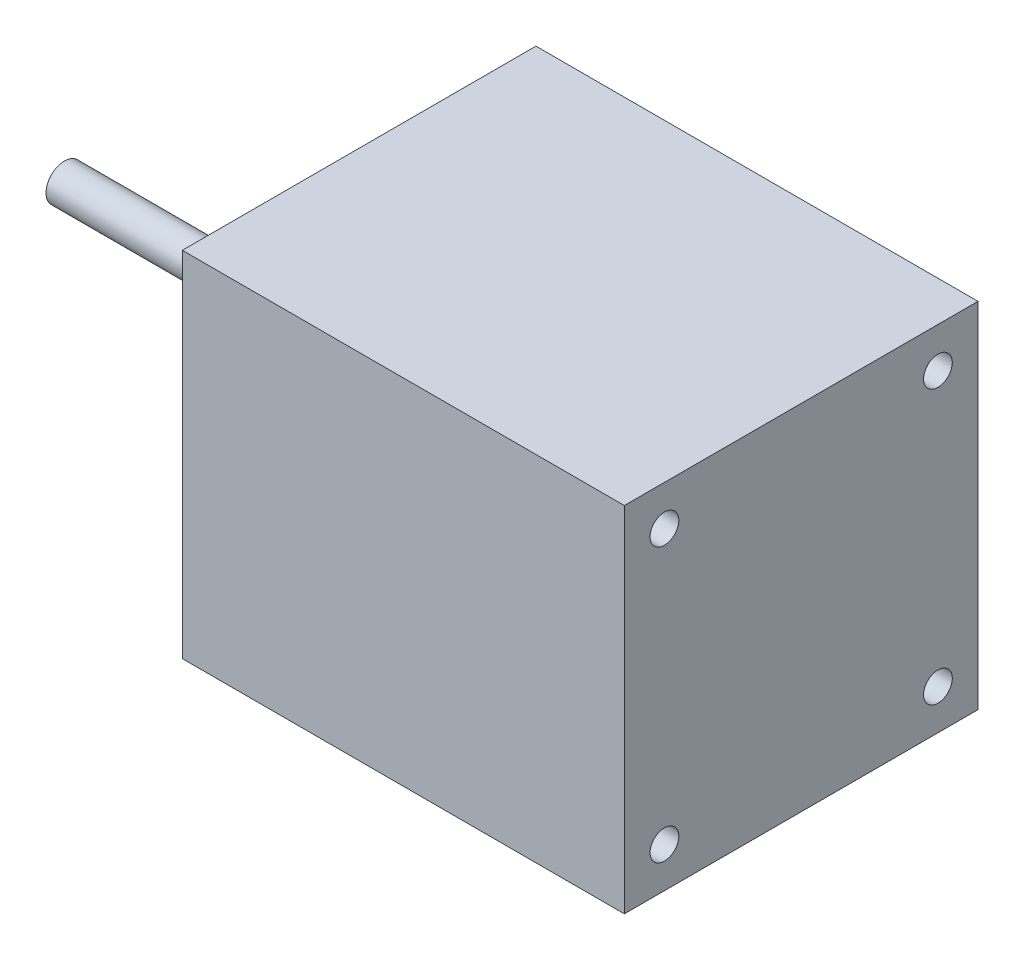
ISO-10303-21;
HEADER;
FILE_DESCRIPTION(('STEP AP214'),'2;1');
FILE_NAME('part.step','',(''),(''),'','','');
FILE_SCHEMA(('AUTOMOTIVE_DESIGN { 1 0 10303 214 1 1 1 1 }'));
ENDSEC;
DATA;
#1=APPLICATION_CONTEXT('core data for automotive mechanical design processes');
#2=APPLICATION_PROTOCOL_DEFINITION('international standard','automotive_design',2000,#1);
#3=PRODUCT_CONTEXT('',#1,'mechanical');
#4=PRODUCT('Part','Part','',(#3));
#5=PRODUCT_RELATED_PRODUCT_CATEGORY('part','',(#4));
#6=PRODUCT_DEFINITION_FORMATION('','',#4);
#7=PRODUCT_DEFINITION_CONTEXT('part definition',#1,'design');
#8=PRODUCT_DEFINITION('design','',#6,#7);
#9=PRODUCT_DEFINITION_SHAPE('','',#8);
#10=(LENGTH_UNIT() NAMED_UNIT(*) SI_UNIT(.MILLI.,.METRE.));
#11=(NAMED_UNIT(*) PLANE_ANGLE_UNIT() SI_UNIT($,.RADIAN.));
#12=(NAMED_UNIT(*) SI_UNIT($,.STERADIAN.) SOLID_ANGLE_UNIT());
#13=UNCERTAINTY_MEASURE_WITH_UNIT(LENGTH_MEASURE(1.E-05),#10,'distance_accuracy_value','');
#14=(GEOMETRIC_REPRESENTATION_CONTEXT(3) GLOBAL_UNCERTAINTY_ASSIGNED_CONTEXT((#13)) GLOBAL_UNIT_ASSIGNED_CONTEXT((#10,
#11,#12)) REPRESENTATION_CONTEXT('',''));
#15=CARTESIAN_POINT('',(0.,0.,0.));
#16=DIRECTION('',(0.,0.,1.));
#17=DIRECTION('',(1.,0.,0.));
#18=AXIS2_PLACEMENT_3D('',#15,#16,#17);
#19=CARTESIAN_POINT('',(76.2,0.,0.));
#20=DIRECTION('',(1.,0.,0.));
#21=DIRECTION('',(0.,0.,-1.));
#22=AXIS2_PLACEMENT_3D('',#19,#20,#21);
#23=PLANE('',#22);
#24=CARTESIAN_POINT('',(76.2,-23.5731723178065,23.5731723178065));
#25=DIRECTION('',(1.,0.,0.));
#26=DIRECTION('',(0.,0.,-1.));
#27=AXIS2_PLACEMENT_3D('',#24,#25,#26);
#28=CIRCLE('',#27,2.4765);
#29=CARTESIAN_POINT('',(76.2,-23.5731723178065,26.0496723178065));
#30=VERTEX_POINT('',#29);
#31=EDGE_CURVE('E249',#30,#30,#28,.T.);
#32=ORIENTED_EDGE('',*,*,#31,.F.);
#33=EDGE_LOOP('',(#32));
#34=FACE_BOUND('',#33,.T.);
#35=CARTESIAN_POINT('',(76.2,23.5731723178065,-23.5731723178065));
#36=DIRECTION('',(1.,0.,0.));
#37=DIRECTION('',(0.,0.,-1.));
#38=AXIS2_PLACEMENT_3D('',#35,#36,#37);
#39=CIRCLE('',#38,2.4765);
#40=CARTESIAN_POINT('',(76.2,23.5731723178065,-21.0966723178065));
#41=VERTEX_POINT('',#40);
#42=EDGE_CURVE('E174',#41,#41,#39,.T.);
#43=ORIENTED_EDGE('',*,*,#42,.F.);
#44=EDGE_LOOP('',(#43));
#45=FACE_BOUND('',#44,.T.);
#46=DIRECTION('',(0.,0.,-1.));
#47=VECTOR('',#46,1.);
#48=CARTESIAN_POINT('',(76.2,-30.48,30.48));
#49=LINE('',#48,#47);
#50=CARTESIAN_POINT('',(76.2,-30.48,30.48));
#51=VERTEX_POINT('',#50);
#52=CARTESIAN_POINT('',(76.2,-30.48,-30.48));
#53=VERTEX_POINT('',#52);
#54=EDGE_CURVE('E151',#51,#53,#49,.T.);
#55=ORIENTED_EDGE('',*,*,#54,.T.);
#56=DIRECTION('',(0.,1.,0.));
#57=VECTOR('',#56,1.);
#58=CARTESIAN_POINT('',(76.2,-30.48,-30.48));
#59=LINE('',#58,#57);
#60=CARTESIAN_POINT('',(76.2,30.48,-30.48));
#61=VERTEX_POINT('',#60);
#62=EDGE_CURVE('E143',#53,#61,#59,.T.);
#63=ORIENTED_EDGE('',*,*,#62,.T.);
#64=DIRECTION('',(0.,0.,-1.));
#65=VECTOR('',#64,1.);
#66=CARTESIAN_POINT('',(76.2,30.48,30.48));
#67=LINE('',#66,#65);
#68=CARTESIAN_POINT('',(76.2,30.48,30.48));
#69=VERTEX_POINT('',#68);
#70=EDGE_CURVE('E150',#69,#61,#67,.T.);
#71=ORIENTED_EDGE('',*,*,#70,.F.);
#72=DIRECTION('',(0.,1.,0.));
#73=VECTOR('',#72,1.);
#74=CARTESIAN_POINT('',(76.2,-30.48,30.48));
#75=LINE('',#74,#73);
#76=EDGE_CURVE('E165',#51,#69,#75,.T.);
#77=ORIENTED_EDGE('',*,*,#76,.F.);
#78=EDGE_LOOP('',(#55,#63,#71,#77));
#79=FACE_BOUND('',#78,.T.);
#80=CARTESIAN_POINT('',(76.2,23.5731723178065,23.5731723178065));
#81=DIRECTION('',(1.,0.,0.));
#82=DIRECTION('',(0.,0.,-1.));
#83=AXIS2_PLACEMENT_3D('',#80,#81,#82);
#84=CIRCLE('',#83,2.4765);
#85=CARTESIAN_POINT('',(76.2,23.5731723178065,26.0496723178065));
#86=VERTEX_POINT('',#85);
#87=EDGE_CURVE('E257',#86,#86,#84,.T.);
#88=ORIENTED_EDGE('',*,*,#87,.F.);
#89=EDGE_LOOP('',(#88));
#90=FACE_BOUND('',#89,.T.);
#91=CARTESIAN_POINT('',(76.2,-23.5731723178065,-23.5731723178065));
#92=DIRECTION('',(1.,0.,0.));
#93=DIRECTION('',(0.,0.,-1.));
#94=AXIS2_PLACEMENT_3D('',#91,#92,#93);
#95=CIRCLE('',#94,2.4765);
#96=CARTESIAN_POINT('',(76.2,-23.5731723178065,-21.0966723178065));
#97=VERTEX_POINT('',#96);
#98=EDGE_CURVE('E242',#97,#97,#95,.T.);
#99=ORIENTED_EDGE('',*,*,#98,.F.);
#100=EDGE_LOOP('',(#99));
#101=FACE_BOUND('',#100,.T.);
#102=ADVANCED_FACE('F99',(#34,#45,#79,#90,#101),#23,.T.);
#103=CARTESIAN_POINT('',(0.,0.,0.));
#104=DIRECTION('',(1.,0.,0.));
#105=DIRECTION('',(0.,0.,-1.));
#106=AXIS2_PLACEMENT_3D('',#103,#104,#105);
#107=PLANE('',#106);
#108=CARTESIAN_POINT('',(0.,0.,0.));
#109=DIRECTION('',(1.,0.,0.));
#110=DIRECTION('',(0.,0.,-1.));
#111=AXIS2_PLACEMENT_3D('',#108,#109,#110);
#112=CIRCLE('',#111,3.175);
#113=CARTESIAN_POINT('',(0.,0.,-3.175));
#114=VERTEX_POINT('',#113);
#115=EDGE_CURVE('E12',#114,#114,#112,.F.);
#116=ORIENTED_EDGE('',*,*,#115,.F.);
#117=EDGE_LOOP('',(#116));
#118=FACE_BOUND('',#117,.T.);
#119=DIRECTION('',(0.,0.,-1.));
#120=VECTOR('',#119,1.);
#121=CARTESIAN_POINT('',(0.,-30.48,30.48));
#122=LINE('',#121,#120);
#123=CARTESIAN_POINT('',(0.,-30.48,30.48));
#124=VERTEX_POINT('',#123);
#125=CARTESIAN_POINT('',(0.,-30.48,-30.48));
#126=VERTEX_POINT('',#125);
#127=EDGE_CURVE('E171',#124,#126,#122,.T.);
#128=ORIENTED_EDGE('',*,*,#127,.F.);
#129=DIRECTION('',(0.,1.,0.));
#130=VECTOR('',#129,1.);
#131=CARTESIAN_POINT('',(0.,-30.48,30.48));
#132=LINE('',#131,#130);
#133=CARTESIAN_POINT('',(0.,30.48,30.48));
#134=VERTEX_POINT('',#133);
#135=EDGE_CURVE('E180',#124,#134,#132,.T.);
#136=ORIENTED_EDGE('',*,*,#135,.T.);
#137=DIRECTION('',(0.,0.,-1.));
#138=VECTOR('',#137,1.);
#139=CARTESIAN_POINT('',(0.,30.48,30.48));
#140=LINE('',#139,#138);
#141=CARTESIAN_POINT('',(0.,30.48,-30.48));
#142=VERTEX_POINT('',#141);
#143=EDGE_CURVE('E177',#134,#142,#140,.T.);
#144=ORIENTED_EDGE('',*,*,#143,.T.);
#145=DIRECTION('',(0.,1.,0.));
#146=VECTOR('',#145,1.);
#147=CARTESIAN_POINT('',(0.,-30.48,-30.48));
#148=LINE('',#147,#146);
#149=EDGE_CURVE('E158',#126,#142,#148,.T.);
#150=ORIENTED_EDGE('',*,*,#149,.F.);
#151=EDGE_LOOP('',(#128,#136,#144,#150));
#152=FACE_BOUND('',#151,.T.);
#153=CARTESIAN_POINT('',(0.,23.5731723178065,-23.5731723178065));
#154=DIRECTION('',(1.,0.,0.));
#155=DIRECTION('',(0.,0.,-1.));
#156=AXIS2_PLACEMENT_3D('',#153,#154,#155);
#157=CIRCLE('',#156,2.4765);
#158=CARTESIAN_POINT('',(0.,23.5731723178065,-21.0966723178065));
#159=VERTEX_POINT('',#158);
#160=EDGE_CURVE('E261',#159,#159,#157,.T.);
#161=ORIENTED_EDGE('',*,*,#160,.T.);
#162=EDGE_LOOP('',(#161));
#163=FACE_BOUND('',#162,.T.);
#164=CARTESIAN_POINT('',(0.,23.5731723178065,23.5731723178065));
#165=DIRECTION('',(1.,0.,0.));
#166=DIRECTION('',(0.,0.,-1.));
#167=AXIS2_PLACEMENT_3D('',#164,#165,#166);
#168=CIRCLE('',#167,2.4765);
#169=CARTESIAN_POINT('',(0.,23.5731723178065,26.0496723178065));
#170=VERTEX_POINT('',#169);
#171=EDGE_CURVE('E253',#170,#170,#168,.T.);
#172=ORIENTED_EDGE('',*,*,#171,.T.);
#173=EDGE_LOOP('',(#172));
#174=FACE_BOUND('',#173,.T.);
#175=CARTESIAN_POINT('',(0.,-23.5731723178065,23.5731723178065));
#176=DIRECTION('',(1.,0.,0.));
#177=DIRECTION('',(0.,0.,-1.));
#178=AXIS2_PLACEMENT_3D('',#175,#176,#177);
#179=CIRCLE('',#178,2.4765);
#180=CARTESIAN_POINT('',(0.,-23.5731723178065,26.0496723178065));
#181=VERTEX_POINT('',#180);
#182=EDGE_CURVE('E247',#181,#181,#179,.T.);
#183=ORIENTED_EDGE('',*,*,#182,.T.);
#184=EDGE_LOOP('',(#183));
#185=FACE_BOUND('',#184,.T.);
#186=CARTESIAN_POINT('',(0.,-23.5731723178065,-23.5731723178065));
#187=DIRECTION('',(1.,0.,0.));
#188=DIRECTION('',(0.,0.,-1.));
#189=AXIS2_PLACEMENT_3D('',#186,#187,#188);
#190=CIRCLE('',#189,2.4765);
#191=CARTESIAN_POINT('',(0.,-23.5731723178065,-21.0966723178065));
#192=VERTEX_POINT('',#191);
#193=EDGE_CURVE('E238',#192,#192,#190,.T.);
#194=ORIENTED_EDGE('',*,*,#193,.T.);
#195=EDGE_LOOP('',(#194));
#196=FACE_BOUND('',#195,.T.);
#197=ADVANCED_FACE('F189',(#118,#152,#163,#174,#185,#196),#107,.F.);
#198=CARTESIAN_POINT('',(76.2,-30.48,30.48));
#199=DIRECTION('',(0.,1.,0.));
#200=DIRECTION('',(0.,0.,1.));
#201=AXIS2_PLACEMENT_3D('',#198,#199,#200);
#202=PLANE('',#201);
#203=ORIENTED_EDGE('',*,*,#127,.T.);
#204=DIRECTION('',(-1.,0.,0.));
#205=VECTOR('',#204,1.);
#206=CARTESIAN_POINT('',(76.2,-30.48,-30.48));
#207=LINE('',#206,#205);
#208=EDGE_CURVE('E109',#53,#126,#207,.T.);
#209=ORIENTED_EDGE('',*,*,#208,.F.);
#210=ORIENTED_EDGE('',*,*,#54,.F.);
#211=DIRECTION('',(-1.,0.,0.));
#212=VECTOR('',#211,1.);
#213=CARTESIAN_POINT('',(76.2,-30.48,30.48));
#214=LINE('',#213,#212);
#215=EDGE_CURVE('E117',#51,#124,#214,.T.);
#216=ORIENTED_EDGE('',*,*,#215,.T.);
#217=EDGE_LOOP('',(#203,#209,#210,#216));
#218=FACE_BOUND('',#217,.T.);
#219=ADVANCED_FACE('F101',(#218),#202,.F.);
#220=CARTESIAN_POINT('',(76.2,-30.48,-30.48));
#221=DIRECTION('',(0.,0.,1.));
#222=DIRECTION('',(1.,0.,0.));
#223=AXIS2_PLACEMENT_3D('',#220,#221,#222);
#224=PLANE('',#223);
#225=ORIENTED_EDGE('',*,*,#149,.T.);
#226=DIRECTION('',(-1.,0.,0.));
#227=VECTOR('',#226,1.);
#228=CARTESIAN_POINT('',(76.2,30.48,-30.48));
#229=LINE('',#228,#227);
#230=EDGE_CURVE('E156',#61,#142,#229,.T.);
#231=ORIENTED_EDGE('',*,*,#230,.F.);
#232=ORIENTED_EDGE('',*,*,#62,.F.);
#233=ORIENTED_EDGE('',*,*,#208,.T.);
#234=EDGE_LOOP('',(#225,#231,#232,#233));
#235=FACE_BOUND('',#234,.T.);
#236=ADVANCED_FACE('F157',(#235),#224,.F.);
#237=CARTESIAN_POINT('',(76.2,30.48,30.48));
#238=DIRECTION('',(0.,1.,0.));
#239=DIRECTION('',(0.,0.,1.));
#240=AXIS2_PLACEMENT_3D('',#237,#238,#239);
#241=PLANE('',#240);
#242=ORIENTED_EDGE('',*,*,#143,.F.);
#243=DIRECTION('',(-1.,0.,0.));
#244=VECTOR('',#243,1.);
#245=CARTESIAN_POINT('',(76.2,30.48,30.48));
#246=LINE('',#245,#244);
#247=EDGE_CURVE('E131',#69,#134,#246,.T.);
#248=ORIENTED_EDGE('',*,*,#247,.F.);
#249=ORIENTED_EDGE('',*,*,#70,.T.);
#250=ORIENTED_EDGE('',*,*,#230,.T.);
#251=EDGE_LOOP('',(#242,#248,#249,#250));
#252=FACE_BOUND('',#251,.T.);
#253=ADVANCED_FACE('F163',(#252),#241,.T.);
#254=CARTESIAN_POINT('',(76.2,-30.48,30.48));
#255=DIRECTION('',(0.,0.,1.));
#256=DIRECTION('',(1.,0.,0.));
#257=AXIS2_PLACEMENT_3D('',#254,#255,#256);
#258=PLANE('',#257);
#259=ORIENTED_EDGE('',*,*,#135,.F.);
#260=ORIENTED_EDGE('',*,*,#215,.F.);
#261=ORIENTED_EDGE('',*,*,#76,.T.);
#262=ORIENTED_EDGE('',*,*,#247,.T.);
#263=EDGE_LOOP('',(#259,#260,#261,#262));
#264=FACE_BOUND('',#263,.T.);
#265=ADVANCED_FACE('F191',(#264),#258,.T.);
#266=CARTESIAN_POINT('',(76.2,23.5731723178065,-23.5731723178065));
#267=DIRECTION('',(-1.,0.,0.));
#268=DIRECTION('',(0.,0.,1.));
#269=AXIS2_PLACEMENT_3D('',#266,#267,#268);
#270=CYLINDRICAL_SURFACE('',#269,2.4765);
#271=CARTESIAN_POINT('',(76.2,23.5731723178065,-21.0966723178065));
#272=CARTESIAN_POINT('',(75.40625,23.5731723178065,-21.0966723178065));
#273=CARTESIAN_POINT('',(74.6125,23.5731723178065,-21.0966723178065));
#274=CARTESIAN_POINT('',(73.025,23.5731723178065,-21.0966723178065));
#275=CARTESIAN_POINT('',(72.23125,23.5731723178065,-21.0966723178065));
#276=CARTESIAN_POINT('',(70.64375,23.5731723178065,-21.0966723178065));
#277=CARTESIAN_POINT('',(69.85,23.5731723178065,-21.0966723178065));
#278=CARTESIAN_POINT('',(68.2625,23.5731723178065,-21.0966723178065));
#279=CARTESIAN_POINT('',(67.46875,23.5731723178065,-21.0966723178065));
#280=CARTESIAN_POINT('',(65.88125,23.5731723178065,-21.0966723178065));
#281=CARTESIAN_POINT('',(65.0875,23.5731723178065,-21.0966723178065));
#282=CARTESIAN_POINT('',(63.5,23.5731723178065,-21.0966723178065));
#283=CARTESIAN_POINT('',(62.70625,23.5731723178065,-21.0966723178065));
#284=CARTESIAN_POINT('',(61.11875,23.5731723178065,-21.0966723178065));
#285=CARTESIAN_POINT('',(60.325,23.5731723178065,-21.0966723178065));
#286=CARTESIAN_POINT('',(58.7375,23.5731723178065,-21.0966723178065));
#287=CARTESIAN_POINT('',(57.94375,23.5731723178065,-21.0966723178065));
#288=CARTESIAN_POINT('',(56.35625,23.5731723178065,-21.0966723178065));
#289=CARTESIAN_POINT('',(55.5625,23.5731723178065,-21.0966723178065));
#290=CARTESIAN_POINT('',(53.975,23.5731723178065,-21.0966723178065));
#291=CARTESIAN_POINT('',(53.18125,23.5731723178065,-21.0966723178065));
#292=CARTESIAN_POINT('',(51.59375,23.5731723178065,-21.0966723178065));
#293=CARTESIAN_POINT('',(50.8,23.5731723178065,-21.0966723178065));
#294=CARTESIAN_POINT('',(49.2125,23.5731723178065,-21.0966723178065));
#295=CARTESIAN_POINT('',(48.41875,23.5731723178065,-21.0966723178065));
#296=CARTESIAN_POINT('',(46.83125,23.5731723178065,-21.0966723178065));
#297=CARTESIAN_POINT('',(46.0375,23.5731723178065,-21.0966723178065));
#298=CARTESIAN_POINT('',(44.45,23.5731723178065,-21.0966723178065));
#299=CARTESIAN_POINT('',(43.65625,23.5731723178065,-21.0966723178065));
#300=CARTESIAN_POINT('',(42.06875,23.5731723178065,-21.0966723178065));
#301=CARTESIAN_POINT('',(41.275,23.5731723178065,-21.0966723178065));
#302=CARTESIAN_POINT('',(39.6875,23.5731723178065,-21.0966723178065));
#303=CARTESIAN_POINT('',(38.89375,23.5731723178065,-21.0966723178065));
#304=CARTESIAN_POINT('',(37.30625,23.5731723178065,-21.0966723178065));
#305=CARTESIAN_POINT('',(36.5125,23.5731723178065,-21.0966723178065));
#306=CARTESIAN_POINT('',(34.925,23.5731723178065,-21.0966723178065));
#307=CARTESIAN_POINT('',(34.13125,23.5731723178065,-21.0966723178065));
#308=CARTESIAN_POINT('',(32.54375,23.5731723178065,-21.0966723178065));
#309=CARTESIAN_POINT('',(31.75,23.5731723178065,-21.0966723178065));
#310=CARTESIAN_POINT('',(30.1625,23.5731723178065,-21.0966723178065));
#311=CARTESIAN_POINT('',(29.36875,23.5731723178065,-21.0966723178065));
#312=CARTESIAN_POINT('',(27.78125,23.5731723178065,-21.0966723178065));
#313=CARTESIAN_POINT('',(26.9875,23.5731723178065,-21.0966723178065));
#314=CARTESIAN_POINT('',(25.4,23.5731723178065,-21.0966723178065));
#315=CARTESIAN_POINT('',(24.60625,23.5731723178065,-21.0966723178065));
#316=CARTESIAN_POINT('',(23.01875,23.5731723178065,-21.0966723178065));
#317=CARTESIAN_POINT('',(22.225,23.5731723178065,-21.0966723178065));
#318=CARTESIAN_POINT('',(20.6375,23.5731723178065,-21.0966723178065));
#319=CARTESIAN_POINT('',(19.84375,23.5731723178065,-21.0966723178065));
#320=CARTESIAN_POINT('',(18.25625,23.5731723178065,-21.0966723178065));
#321=CARTESIAN_POINT('',(17.4625,23.5731723178065,-21.0966723178065));
#322=CARTESIAN_POINT('',(15.875,23.5731723178065,-21.0966723178065));
#323=CARTESIAN_POINT('',(15.08125,23.5731723178065,-21.0966723178065));
#324=CARTESIAN_POINT('',(13.49375,23.5731723178065,-21.0966723178065));
#325=CARTESIAN_POINT('',(12.7,23.5731723178065,-21.0966723178065));
#326=CARTESIAN_POINT('',(11.1125,23.5731723178065,-21.0966723178065));
#327=CARTESIAN_POINT('',(10.31875,23.5731723178065,-21.0966723178065));
#328=CARTESIAN_POINT('',(8.73125,23.5731723178065,-21.0966723178065));
#329=CARTESIAN_POINT('',(7.93750000000001,23.5731723178065,-21.0966723178065));
#330=CARTESIAN_POINT('',(6.35,23.5731723178065,-21.0966723178065));
#331=CARTESIAN_POINT('',(5.55625,23.5731723178065,-21.0966723178065));
#332=CARTESIAN_POINT('',(3.96875,23.5731723178065,-21.0966723178065));
#333=CARTESIAN_POINT('',(3.175,23.5731723178065,-21.0966723178065));
#334=CARTESIAN_POINT('',(1.5875,23.5731723178065,-21.0966723178065));
#335=CARTESIAN_POINT('',(0.793750000000001,23.5731723178065,-21.0966723178065));
#336=CARTESIAN_POINT('',(0.,23.5731723178065,-21.0966723178065));
#337=B_SPLINE_CURVE_WITH_KNOTS('',3,(#271,#272,#273,#274,#275,#276,#277,#278,#279,#280,#281,
#282,#283,#284,#285,#286,#287,#288,#289,#290,#291,#292,#293,#294,#295,#296,#297,#298,#299,#300,
#301,#302,#303,#304,#305,#306,#307,#308,#309,#310,#311,#312,#313,#314,#315,#316,#317,#318,#319,
#320,#321,#322,#323,#324,#325,#326,#327,#328,#329,#330,#331,#332,#333,#334,#335,#336),
.UNSPECIFIED.,.F.,.F.,(4,2,2,2,2,2,2,2,2,2,2,2,2,2,2,2,2,2,2,2,2,2,2,2,2,2,2,2,2,2,2,2,4),(0.,
2.38125,4.7625,7.14375,9.52500000000001,11.90625,14.2875,16.66875,19.05,21.43125,23.8125,
26.19375,28.575,30.95625,33.3375,35.71875,38.1,40.48125,42.8625,45.24375,47.625,50.00625,
52.3875,54.76875,57.15,59.53125,61.9125,64.29375,66.675,69.05625,71.4375,73.81875,76.2),.UNSPECIFIED.);
#338=EDGE_CURVE('BSEAM193',#41,#159,#337,.T.);
#339=ORIENTED_EDGE('',*,*,#42,.T.);
#340=ORIENTED_EDGE('',*,*,#160,.F.);
#341=ORIENTED_EDGE('',*,*,#338,.T.);
#342=ORIENTED_EDGE('',*,*,#338,.F.);
#343=EDGE_LOOP('',(#339,#341,#340,#342));
#344=FACE_BOUND('',#343,.T.);
#345=ADVANCED_FACE('F193',(#344),#270,.F.);
#346=CARTESIAN_POINT('',(76.2,23.5731723178065,23.5731723178065));
#347=DIRECTION('',(-1.,0.,0.));
#348=DIRECTION('',(0.,0.,1.));
#349=AXIS2_PLACEMENT_3D('',#346,#347,#348);
#350=CYLINDRICAL_SURFACE('',#349,2.4765);
#351=CARTESIAN_POINT('',(76.2,23.5731723178065,26.0496723178065));
#352=CARTESIAN_POINT('',(75.40625,23.5731723178065,26.0496723178065));
#353=CARTESIAN_POINT('',(74.6125,23.5731723178065,26.0496723178065));
#354=CARTESIAN_POINT('',(73.025,23.5731723178065,26.0496723178065));
#355=CARTESIAN_POINT('',(72.23125,23.5731723178065,26.0496723178065));
#356=CARTESIAN_POINT('',(70.64375,23.5731723178065,26.0496723178065));
#357=CARTESIAN_POINT('',(69.85,23.5731723178065,26.0496723178065));
#358=CARTESIAN_POINT('',(68.2625,23.5731723178065,26.0496723178065));
#359=CARTESIAN_POINT('',(67.46875,23.5731723178065,26.0496723178065));
#360=CARTESIAN_POINT('',(65.88125,23.5731723178065,26.0496723178065));
#361=CARTESIAN_POINT('',(65.0875,23.5731723178065,26.0496723178065));
#362=CARTESIAN_POINT('',(63.5,23.5731723178065,26.0496723178065));
#363=CARTESIAN_POINT('',(62.70625,23.5731723178065,26.0496723178065));
#364=CARTESIAN_POINT('',(61.11875,23.5731723178065,26.0496723178065));
#365=CARTESIAN_POINT('',(60.325,23.5731723178065,26.0496723178065));
#366=CARTESIAN_POINT('',(58.7375,23.5731723178065,26.0496723178065));
#367=CARTESIAN_POINT('',(57.94375,23.5731723178065,26.0496723178065));
#368=CARTESIAN_POINT('',(56.35625,23.5731723178065,26.0496723178065));
#369=CARTESIAN_POINT('',(55.5625,23.5731723178065,26.0496723178065));
#370=CARTESIAN_POINT('',(53.975,23.5731723178065,26.0496723178065));
#371=CARTESIAN_POINT('',(53.18125,23.5731723178065,26.0496723178065));
#372=CARTESIAN_POINT('',(51.59375,23.5731723178065,26.0496723178065));
#373=CARTESIAN_POINT('',(50.8,23.5731723178065,26.0496723178065));
#374=CARTESIAN_POINT('',(49.2125,23.5731723178065,26.0496723178065));
#375=CARTESIAN_POINT('',(48.41875,23.5731723178065,26.0496723178065));
#376=CARTESIAN_POINT('',(46.83125,23.5731723178065,26.0496723178065));
#377=CARTESIAN_POINT('',(46.0375,23.5731723178065,26.0496723178065));
#378=CARTESIAN_POINT('',(44.45,23.5731723178065,26.0496723178065));
#379=CARTESIAN_POINT('',(43.65625,23.5731723178065,26.0496723178065));
#380=CARTESIAN_POINT('',(42.06875,23.5731723178065,26.0496723178065));
#381=CARTESIAN_POINT('',(41.275,23.5731723178065,26.0496723178065));
#382=CARTESIAN_POINT('',(39.6875,23.5731723178065,26.0496723178065));
#383=CARTESIAN_POINT('',(38.89375,23.5731723178065,26.0496723178065));
#384=CARTESIAN_POINT('',(37.30625,23.5731723178065,26.0496723178065));
#385=CARTESIAN_POINT('',(36.5125,23.5731723178065,26.0496723178065));
#386=CARTESIAN_POINT('',(34.925,23.5731723178065,26.0496723178065));
#387=CARTESIAN_POINT('',(34.13125,23.5731723178065,26.0496723178065));
#388=CARTESIAN_POINT('',(32.54375,23.5731723178065,26.0496723178065));
#389=CARTESIAN_POINT('',(31.75,23.5731723178065,26.0496723178065));
#390=CARTESIAN_POINT('',(30.1625,23.5731723178065,26.0496723178065));
#391=CARTESIAN_POINT('',(29.36875,23.5731723178065,26.0496723178065));
#392=CARTESIAN_POINT('',(27.78125,23.5731723178065,26.0496723178065));
#393=CARTESIAN_POINT('',(26.9875,23.5731723178065,26.0496723178065));
#394=CARTESIAN_POINT('',(25.4,23.5731723178065,26.0496723178065));
#395=CARTESIAN_POINT('',(24.60625,23.5731723178065,26.0496723178065));
#396=CARTESIAN_POINT('',(23.01875,23.5731723178065,26.0496723178065));
#397=CARTESIAN_POINT('',(22.225,23.5731723178065,26.0496723178065));
#398=CARTESIAN_POINT('',(20.6375,23.5731723178065,26.0496723178065));
#399=CARTESIAN_POINT('',(19.84375,23.5731723178065,26.0496723178065));
#400=CARTESIAN_POINT('',(18.25625,23.5731723178065,26.0496723178065));
#401=CARTESIAN_POINT('',(17.4625,23.5731723178065,26.0496723178065));
#402=CARTESIAN_POINT('',(15.875,23.5731723178065,26.0496723178065));
#403=CARTESIAN_POINT('',(15.08125,23.5731723178065,26.0496723178065));
#404=CARTESIAN_POINT('',(13.49375,23.5731723178065,26.0496723178065));
#405=CARTESIAN_POINT('',(12.7,23.5731723178065,26.0496723178065));
#406=CARTESIAN_POINT('',(11.1125,23.5731723178065,26.0496723178065));
#407=CARTESIAN_POINT('',(10.31875,23.5731723178065,26.0496723178065));
#408=CARTESIAN_POINT('',(8.73125,23.5731723178065,26.0496723178065));
#409=CARTESIAN_POINT('',(7.93750000000001,23.5731723178065,26.0496723178065));
#410=CARTESIAN_POINT('',(6.35,23.5731723178065,26.0496723178065));
#411=CARTESIAN_POINT('',(5.55625,23.5731723178065,26.0496723178065));
#412=CARTESIAN_POINT('',(3.96875,23.5731723178065,26.0496723178065));
#413=CARTESIAN_POINT('',(3.175,23.5731723178065,26.0496723178065));
#414=CARTESIAN_POINT('',(1.5875,23.5731723178065,26.0496723178065));
#415=CARTESIAN_POINT('',(0.793750000000001,23.5731723178065,26.0496723178065));
#416=CARTESIAN_POINT('',(0.,23.5731723178065,26.0496723178065));
#417=B_SPLINE_CURVE_WITH_KNOTS('',3,(#351,#352,#353,#354,#355,#356,#357,#358,#359,#360,#361,
#362,#363,#364,#365,#366,#367,#368,#369,#370,#371,#372,#373,#374,#375,#376,#377,#378,#379,#380,
#381,#382,#383,#384,#385,#386,#387,#388,#389,#390,#391,#392,#393,#394,#395,#396,#397,#398,#399,
#400,#401,#402,#403,#404,#405,#406,#407,#408,#409,#410,#411,#412,#413,#414,#415,#416),
.UNSPECIFIED.,.F.,.F.,(4,2,2,2,2,2,2,2,2,2,2,2,2,2,2,2,2,2,2,2,2,2,2,2,2,2,2,2,2,2,2,2,4),(0.,
2.38125,4.7625,7.14375,9.52500000000001,11.90625,14.2875,16.66875,19.05,21.43125,23.8125,
26.19375,28.575,30.95625,33.3375,35.71875,38.1,40.48125,42.8625,45.24375,47.625,50.00625,
52.3875,54.76875,57.15,59.53125,61.9125,64.29375,66.675,69.05625,71.4375,73.81875,76.2),.UNSPECIFIED.);
#418=EDGE_CURVE('BSEAM199',#86,#170,#417,.T.);
#419=ORIENTED_EDGE('',*,*,#87,.T.);
#420=ORIENTED_EDGE('',*,*,#171,.F.);
#421=ORIENTED_EDGE('',*,*,#418,.T.);
#422=ORIENTED_EDGE('',*,*,#418,.F.);
#423=EDGE_LOOP('',(#419,#421,#420,#422));
#424=FACE_BOUND('',#423,.T.);
#425=ADVANCED_FACE('F199',(#424),#350,.F.);
#426=CARTESIAN_POINT('',(76.2,-23.5731723178065,23.5731723178065));
#427=DIRECTION('',(-1.,0.,0.));
#428=DIRECTION('',(0.,0.,1.));
#429=AXIS2_PLACEMENT_3D('',#426,#427,#428);
#430=CYLINDRICAL_SURFACE('',#429,2.4765);
#431=CARTESIAN_POINT('',(76.2,-23.5731723178065,26.0496723178065));
#432=CARTESIAN_POINT('',(75.40625,-23.5731723178065,26.0496723178065));
#433=CARTESIAN_POINT('',(74.6125,-23.5731723178065,26.0496723178065));
#434=CARTESIAN_POINT('',(73.025,-23.5731723178065,26.0496723178065));
#435=CARTESIAN_POINT('',(72.23125,-23.5731723178065,26.0496723178065));
#436=CARTESIAN_POINT('',(70.64375,-23.5731723178065,26.0496723178065));
#437=CARTESIAN_POINT('',(69.85,-23.5731723178065,26.0496723178065));
#438=CARTESIAN_POINT('',(68.2625,-23.5731723178065,26.0496723178065));
#439=CARTESIAN_POINT('',(67.46875,-23.5731723178065,26.0496723178065));
#440=CARTESIAN_POINT('',(65.88125,-23.5731723178065,26.0496723178065));
#441=CARTESIAN_POINT('',(65.0875,-23.5731723178065,26.0496723178065));
#442=CARTESIAN_POINT('',(63.5,-23.5731723178065,26.0496723178065));
#443=CARTESIAN_POINT('',(62.70625,-23.5731723178065,26.0496723178065));
#444=CARTESIAN_POINT('',(61.11875,-23.5731723178065,26.0496723178065));
#445=CARTESIAN_POINT('',(60.325,-23.5731723178065,26.0496723178065));
#446=CARTESIAN_POINT('',(58.7375,-23.5731723178065,26.0496723178065));
#447=CARTESIAN_POINT('',(57.94375,-23.5731723178065,26.0496723178065));
#448=CARTESIAN_POINT('',(56.35625,-23.5731723178065,26.0496723178065));
#449=CARTESIAN_POINT('',(55.5625,-23.5731723178065,26.0496723178065));
#450=CARTESIAN_POINT('',(53.975,-23.5731723178065,26.0496723178065));
#451=CARTESIAN_POINT('',(53.18125,-23.5731723178065,26.0496723178065));
#452=CARTESIAN_POINT('',(51.59375,-23.5731723178065,26.0496723178065));
#453=CARTESIAN_POINT('',(50.8,-23.5731723178065,26.0496723178065));
#454=CARTESIAN_POINT('',(49.2125,-23.5731723178065,26.0496723178065));
#455=CARTESIAN_POINT('',(48.41875,-23.5731723178065,26.0496723178065));
#456=CARTESIAN_POINT('',(46.83125,-23.5731723178065,26.0496723178065));
#457=CARTESIAN_POINT('',(46.0375,-23.5731723178065,26.0496723178065));
#458=CARTESIAN_POINT('',(44.45,-23.5731723178065,26.0496723178065));
#459=CARTESIAN_POINT('',(43.65625,-23.5731723178065,26.0496723178065));
#460=CARTESIAN_POINT('',(42.06875,-23.5731723178065,26.0496723178065));
#461=CARTESIAN_POINT('',(41.275,-23.5731723178065,26.0496723178065));
#462=CARTESIAN_POINT('',(39.6875,-23.5731723178065,26.0496723178065));
#463=CARTESIAN_POINT('',(38.89375,-23.5731723178065,26.0496723178065));
#464=CARTESIAN_POINT('',(37.30625,-23.5731723178065,26.0496723178065));
#465=CARTESIAN_POINT('',(36.5125,-23.5731723178065,26.0496723178065));
#466=CARTESIAN_POINT('',(34.925,-23.5731723178065,26.0496723178065));
#467=CARTESIAN_POINT('',(34.13125,-23.5731723178065,26.0496723178065));
#468=CARTESIAN_POINT('',(32.54375,-23.5731723178065,26.0496723178065));
#469=CARTESIAN_POINT('',(31.75,-23.5731723178065,26.0496723178065));
#470=CARTESIAN_POINT('',(30.1625,-23.5731723178065,26.0496723178065));
#471=CARTESIAN_POINT('',(29.36875,-23.5731723178065,26.0496723178065));
#472=CARTESIAN_POINT('',(27.78125,-23.5731723178065,26.0496723178065));
#473=CARTESIAN_POINT('',(26.9875,-23.5731723178065,26.0496723178065));
#474=CARTESIAN_POINT('',(25.4,-23.5731723178065,26.0496723178065));
#475=CARTESIAN_POINT('',(24.60625,-23.5731723178065,26.0496723178065));
#476=CARTESIAN_POINT('',(23.01875,-23.5731723178065,26.0496723178065));
#477=CARTESIAN_POINT('',(22.225,-23.5731723178065,26.0496723178065));
#478=CARTESIAN_POINT('',(20.6375,-23.5731723178065,26.0496723178065));
#479=CARTESIAN_POINT('',(19.84375,-23.5731723178065,26.0496723178065));
#480=CARTESIAN_POINT('',(18.25625,-23.5731723178065,26.0496723178065));
#481=CARTESIAN_POINT('',(17.4625,-23.5731723178065,26.0496723178065));
#482=CARTESIAN_POINT('',(15.875,-23.5731723178065,26.0496723178065));
#483=CARTESIAN_POINT('',(15.08125,-23.5731723178065,26.0496723178065));
#484=CARTESIAN_POINT('',(13.49375,-23.5731723178065,26.0496723178065));
#485=CARTESIAN_POINT('',(12.7,-23.5731723178065,26.0496723178065));
#486=CARTESIAN_POINT('',(11.1125,-23.5731723178065,26.0496723178065));
#487=CARTESIAN_POINT('',(10.31875,-23.5731723178065,26.0496723178065));
#488=CARTESIAN_POINT('',(8.73125,-23.5731723178065,26.0496723178065));
#489=CARTESIAN_POINT('',(7.93750000000001,-23.5731723178065,26.0496723178065));
#490=CARTESIAN_POINT('',(6.35,-23.5731723178065,26.0496723178065));
#491=CARTESIAN_POINT('',(5.55625,-23.5731723178065,26.0496723178065));
#492=CARTESIAN_POINT('',(3.96875,-23.5731723178065,26.0496723178065));
#493=CARTESIAN_POINT('',(3.175,-23.5731723178065,26.0496723178065));
#494=CARTESIAN_POINT('',(1.5875,-23.5731723178065,26.0496723178065));
#495=CARTESIAN_POINT('',(0.793750000000001,-23.5731723178065,26.0496723178065));
#496=CARTESIAN_POINT('',(0.,-23.5731723178065,26.0496723178065));
#497=B_SPLINE_CURVE_WITH_KNOTS('',3,(#431,#432,#433,#434,#435,#436,#437,#438,#439,#440,#441,
#442,#443,#444,#445,#446,#447,#448,#449,#450,#451,#452,#453,#454,#455,#456,#457,#458,#459,#460,
#461,#462,#463,#464,#465,#466,#467,#468,#469,#470,#471,#472,#473,#474,#475,#476,#477,#478,#479,
#480,#481,#482,#483,#484,#485,#486,#487,#488,#489,#490,#491,#492,#493,#494,#495,#496),
.UNSPECIFIED.,.F.,.F.,(4,2,2,2,2,2,2,2,2,2,2,2,2,2,2,2,2,2,2,2,2,2,2,2,2,2,2,2,2,2,2,2,4),(0.,
2.38125,4.7625,7.14375,9.52500000000001,11.90625,14.2875,16.66875,19.05,21.43125,23.8125,
26.19375,28.575,30.95625,33.3375,35.71875,38.1,40.48125,42.8625,45.24375,47.625,50.00625,
52.3875,54.76875,57.15,59.53125,61.9125,64.29375,66.675,69.05625,71.4375,73.81875,76.2),.UNSPECIFIED.);
#498=EDGE_CURVE('BSEAM216',#30,#181,#497,.T.);
#499=ORIENTED_EDGE('',*,*,#31,.T.);
#500=ORIENTED_EDGE('',*,*,#182,.F.);
#501=ORIENTED_EDGE('',*,*,#498,.T.);
#502=ORIENTED_EDGE('',*,*,#498,.F.);
#503=EDGE_LOOP('',(#499,#501,#500,#502));
#504=FACE_BOUND('',#503,.T.);
#505=ADVANCED_FACE('F216',(#504),#430,.F.);
#506=CARTESIAN_POINT('',(76.2,-23.5731723178065,-23.5731723178065));
#507=DIRECTION('',(-1.,0.,0.));
#508=DIRECTION('',(0.,0.,1.));
#509=AXIS2_PLACEMENT_3D('',#506,#507,#508);
#510=CYLINDRICAL_SURFACE('',#509,2.4765);
#511=CARTESIAN_POINT('',(76.2,-23.5731723178065,-21.0966723178065));
#512=CARTESIAN_POINT('',(75.40625,-23.5731723178065,-21.0966723178065));
#513=CARTESIAN_POINT('',(74.6125,-23.5731723178065,-21.0966723178065));
#514=CARTESIAN_POINT('',(73.025,-23.5731723178065,-21.0966723178065));
#515=CARTESIAN_POINT('',(72.23125,-23.5731723178065,-21.0966723178065));
#516=CARTESIAN_POINT('',(70.64375,-23.5731723178065,-21.0966723178065));
#517=CARTESIAN_POINT('',(69.85,-23.5731723178065,-21.0966723178065));
#518=CARTESIAN_POINT('',(68.2625,-23.5731723178065,-21.0966723178065));
#519=CARTESIAN_POINT('',(67.46875,-23.5731723178065,-21.0966723178065));
#520=CARTESIAN_POINT('',(65.88125,-23.5731723178065,-21.0966723178065));
#521=CARTESIAN_POINT('',(65.0875,-23.5731723178065,-21.0966723178065));
#522=CARTESIAN_POINT('',(63.5,-23.5731723178065,-21.0966723178065));
#523=CARTESIAN_POINT('',(62.70625,-23.5731723178065,-21.0966723178065));
#524=CARTESIAN_POINT('',(61.11875,-23.5731723178065,-21.0966723178065));
#525=CARTESIAN_POINT('',(60.325,-23.5731723178065,-21.0966723178065));
#526=CARTESIAN_POINT('',(58.7375,-23.5731723178065,-21.0966723178065));
#527=CARTESIAN_POINT('',(57.94375,-23.5731723178065,-21.0966723178065));
#528=CARTESIAN_POINT('',(56.35625,-23.5731723178065,-21.0966723178065));
#529=CARTESIAN_POINT('',(55.5625,-23.5731723178065,-21.0966723178065));
#530=CARTESIAN_POINT('',(53.975,-23.5731723178065,-21.0966723178065));
#531=CARTESIAN_POINT('',(53.18125,-23.5731723178065,-21.0966723178065));
#532=CARTESIAN_POINT('',(51.59375,-23.5731723178065,-21.0966723178065));
#533=CARTESIAN_POINT('',(50.8,-23.5731723178065,-21.0966723178065));
#534=CARTESIAN_POINT('',(49.2125,-23.5731723178065,-21.0966723178065));
#535=CARTESIAN_POINT('',(48.41875,-23.5731723178065,-21.0966723178065));
#536=CARTESIAN_POINT('',(46.83125,-23.5731723178065,-21.0966723178065));
#537=CARTESIAN_POINT('',(46.0375,-23.5731723178065,-21.0966723178065));
#538=CARTESIAN_POINT('',(44.45,-23.5731723178065,-21.0966723178065));
#539=CARTESIAN_POINT('',(43.65625,-23.5731723178065,-21.0966723178065));
#540=CARTESIAN_POINT('',(42.06875,-23.5731723178065,-21.0966723178065));
#541=CARTESIAN_POINT('',(41.275,-23.5731723178065,-21.0966723178065));
#542=CARTESIAN_POINT('',(39.6875,-23.5731723178065,-21.0966723178065));
#543=CARTESIAN_POINT('',(38.89375,-23.5731723178065,-21.0966723178065));
#544=CARTESIAN_POINT('',(37.30625,-23.5731723178065,-21.0966723178065));
#545=CARTESIAN_POINT('',(36.5125,-23.5731723178065,-21.0966723178065));
#546=CARTESIAN_POINT('',(34.925,-23.5731723178065,-21.0966723178065));
#547=CARTESIAN_POINT('',(34.13125,-23.5731723178065,-21.0966723178065));
#548=CARTESIAN_POINT('',(32.54375,-23.5731723178065,-21.0966723178065));
#549=CARTESIAN_POINT('',(31.75,-23.5731723178065,-21.0966723178065));
#550=CARTESIAN_POINT('',(30.1625,-23.5731723178065,-21.0966723178065));
#551=CARTESIAN_POINT('',(29.36875,-23.5731723178065,-21.0966723178065));
#552=CARTESIAN_POINT('',(27.78125,-23.5731723178065,-21.0966723178065));
#553=CARTESIAN_POINT('',(26.9875,-23.5731723178065,-21.0966723178065));
#554=CARTESIAN_POINT('',(25.4,-23.5731723178065,-21.0966723178065));
#555=CARTESIAN_POINT('',(24.60625,-23.5731723178065,-21.0966723178065));
#556=CARTESIAN_POINT('',(23.01875,-23.5731723178065,-21.0966723178065));
#557=CARTESIAN_POINT('',(22.225,-23.5731723178065,-21.0966723178065));
#558=CARTESIAN_POINT('',(20.6375,-23.5731723178065,-21.0966723178065));
#559=CARTESIAN_POINT('',(19.84375,-23.5731723178065,-21.0966723178065));
#560=CARTESIAN_POINT('',(18.25625,-23.5731723178065,-21.0966723178065));
#561=CARTESIAN_POINT('',(17.4625,-23.5731723178065,-21.0966723178065));
#562=CARTESIAN_POINT('',(15.875,-23.5731723178065,-21.0966723178065));
#563=CARTESIAN_POINT('',(15.08125,-23.5731723178065,-21.0966723178065));
#564=CARTESIAN_POINT('',(13.49375,-23.5731723178065,-21.0966723178065));
#565=CARTESIAN_POINT('',(12.7,-23.5731723178065,-21.0966723178065));
#566=CARTESIAN_POINT('',(11.1125,-23.5731723178065,-21.0966723178065));
#567=CARTESIAN_POINT('',(10.31875,-23.5731723178065,-21.0966723178065));
#568=CARTESIAN_POINT('',(8.73125,-23.5731723178065,-21.0966723178065));
#569=CARTESIAN_POINT('',(7.93750000000001,-23.5731723178065,-21.0966723178065));
#570=CARTESIAN_POINT('',(6.35,-23.5731723178065,-21.0966723178065));
#571=CARTESIAN_POINT('',(5.55625,-23.5731723178065,-21.0966723178065));
#572=CARTESIAN_POINT('',(3.96875,-23.5731723178065,-21.0966723178065));
#573=CARTESIAN_POINT('',(3.175,-23.5731723178065,-21.0966723178065));
#574=CARTESIAN_POINT('',(1.5875,-23.5731723178065,-21.0966723178065));
#575=CARTESIAN_POINT('',(0.793750000000001,-23.5731723178065,-21.0966723178065));
#576=CARTESIAN_POINT('',(0.,-23.5731723178065,-21.0966723178065));
#577=B_SPLINE_CURVE_WITH_KNOTS('',3,(#511,#512,#513,#514,#515,#516,#517,#518,#519,#520,#521,
#522,#523,#524,#525,#526,#527,#528,#529,#530,#531,#532,#533,#534,#535,#536,#537,#538,#539,#540,
#541,#542,#543,#544,#545,#546,#547,#548,#549,#550,#551,#552,#553,#554,#555,#556,#557,#558,#559,
#560,#561,#562,#563,#564,#565,#566,#567,#568,#569,#570,#571,#572,#573,#574,#575,#576),
.UNSPECIFIED.,.F.,.F.,(4,2,2,2,2,2,2,2,2,2,2,2,2,2,2,2,2,2,2,2,2,2,2,2,2,2,2,2,2,2,2,2,4),(0.,
2.38125,4.7625,7.14375,9.52500000000001,11.90625,14.2875,16.66875,19.05,21.43125,23.8125,
26.19375,28.575,30.95625,33.3375,35.71875,38.1,40.48125,42.8625,45.24375,47.625,50.00625,
52.3875,54.76875,57.15,59.53125,61.9125,64.29375,66.675,69.05625,71.4375,73.81875,76.2),.UNSPECIFIED.);
#578=EDGE_CURVE('BSEAM220',#97,#192,#577,.T.);
#579=ORIENTED_EDGE('',*,*,#98,.T.);
#580=ORIENTED_EDGE('',*,*,#193,.F.);
#581=ORIENTED_EDGE('',*,*,#578,.T.);
#582=ORIENTED_EDGE('',*,*,#578,.F.);
#583=EDGE_LOOP('',(#579,#581,#580,#582));
#584=FACE_BOUND('',#583,.T.);
#585=ADVANCED_FACE('F220',(#584),#510,.F.);
#586=CARTESIAN_POINT('',(-50.8,0.,0.));
#587=DIRECTION('',(1.,0.,0.));
#588=DIRECTION('',(0.,0.,-1.));
#589=AXIS2_PLACEMENT_3D('',#586,#587,#588);
#590=CYLINDRICAL_SURFACE('',#589,3.175);
#591=CARTESIAN_POINT('',(-50.8,0.,0.));
#592=DIRECTION('',(-1.,0.,0.));
#593=DIRECTION('',(0.,0.,1.));
#594=AXIS2_PLACEMENT_3D('',#591,#592,#593);
#595=CIRCLE('',#594,3.175);
#596=CARTESIAN_POINT('',(-50.8,0.,3.175));
#597=VERTEX_POINT('',#596);
#598=EDGE_CURVE('E236',#597,#597,#595,.T.);
#599=ORIENTED_EDGE('',*,*,#598,.F.);
#600=EDGE_LOOP('',(#599));
#601=FACE_BOUND('',#600,.T.);
#602=ORIENTED_EDGE('',*,*,#115,.T.);
#603=EDGE_LOOP('',(#602));
#604=FACE_BOUND('',#603,.T.);
#605=ADVANCED_FACE('F224',(#601,#604),#590,.T.);
#606=CARTESIAN_POINT('',(-50.8,0.,0.));
#607=DIRECTION('',(-1.,0.,0.));
#608=DIRECTION('',(0.,0.,1.));
#609=AXIS2_PLACEMENT_3D('',#606,#607,#608);
#610=PLANE('',#609);
#611=ORIENTED_EDGE('',*,*,#598,.T.);
#612=EDGE_LOOP('',(#611));
#613=FACE_BOUND('',#612,.T.);
#614=ADVANCED_FACE('F228',(#613),#610,.T.);
#615=CLOSED_SHELL('',(#102,#197,#219,#236,#253,#265,#345,#425,#505,#585,#605,#614));
#616=MANIFOLD_SOLID_BREP('B2',#615);
#617=ADVANCED_BREP_SHAPE_REPRESENTATION('',(#18,#616),#14);
#618=SHAPE_DEFINITION_REPRESENTATION(#9,#617);
ENDSEC;
END-ISO-10303-21;
